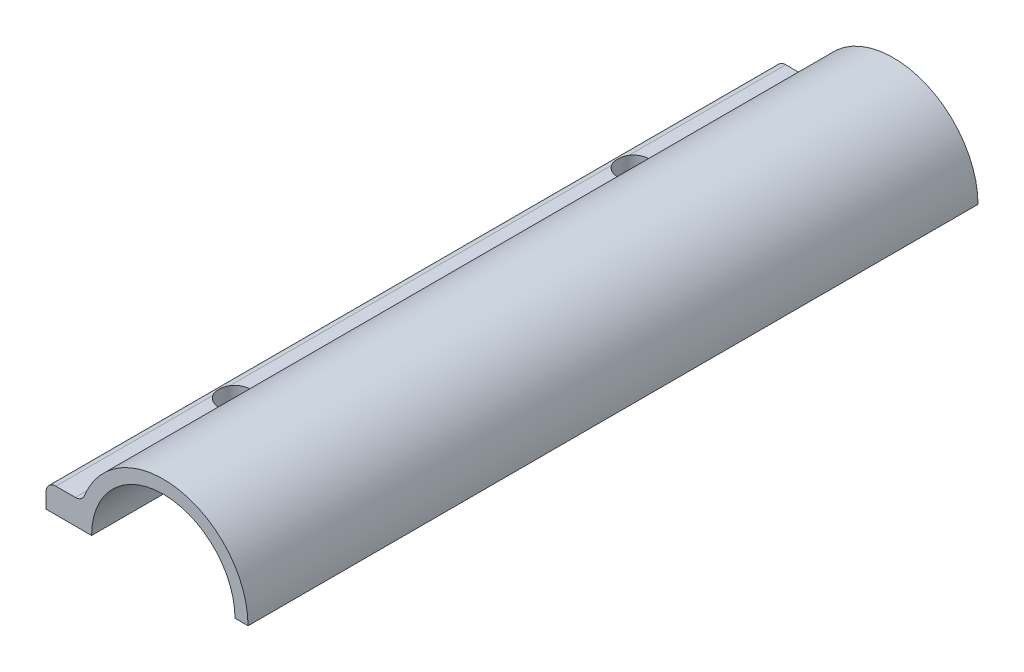
ISO-10303-21;
HEADER;
FILE_DESCRIPTION(('STEP AP214'),'2;1');
FILE_NAME('part.step','',(''),(''),'','','');
FILE_SCHEMA(('AUTOMOTIVE_DESIGN { 1 0 10303 214 1 1 1 1 }'));
ENDSEC;
DATA;
#1=APPLICATION_CONTEXT('core data for automotive mechanical design processes');
#2=APPLICATION_PROTOCOL_DEFINITION('international standard','automotive_design',2000,#1);
#3=PRODUCT_CONTEXT('',#1,'mechanical');
#4=PRODUCT('Part','Part','',(#3));
#5=PRODUCT_RELATED_PRODUCT_CATEGORY('part','',(#4));
#6=PRODUCT_DEFINITION_FORMATION('','',#4);
#7=PRODUCT_DEFINITION_CONTEXT('part definition',#1,'design');
#8=PRODUCT_DEFINITION('design','',#6,#7);
#9=PRODUCT_DEFINITION_SHAPE('','',#8);
#10=(LENGTH_UNIT() NAMED_UNIT(*) SI_UNIT(.MILLI.,.METRE.));
#11=(NAMED_UNIT(*) PLANE_ANGLE_UNIT() SI_UNIT($,.RADIAN.));
#12=(NAMED_UNIT(*) SI_UNIT($,.STERADIAN.) SOLID_ANGLE_UNIT());
#13=UNCERTAINTY_MEASURE_WITH_UNIT(LENGTH_MEASURE(1.E-05),#10,'distance_accuracy_value','');
#14=(GEOMETRIC_REPRESENTATION_CONTEXT(3) GLOBAL_UNCERTAINTY_ASSIGNED_CONTEXT((#13)) GLOBAL_UNIT_ASSIGNED_CONTEXT((#10,
#11,#12)) REPRESENTATION_CONTEXT('',''));
#15=CARTESIAN_POINT('',(0.,0.,0.));
#16=DIRECTION('',(0.,0.,1.));
#17=DIRECTION('',(1.,0.,0.));
#18=AXIS2_PLACEMENT_3D('',#15,#16,#17);
#19=CARTESIAN_POINT('',(0.,0.,112.));
#20=DIRECTION('',(0.,0.,-1.));
#21=DIRECTION('',(-1.,0.,0.));
#22=AXIS2_PLACEMENT_3D('',#19,#20,#21);
#23=CYLINDRICAL_SURFACE('',#22,13.);
#24=CARTESIAN_POINT('',(-12.4291552408038,3.81,90.0222217904894));
#25=CARTESIAN_POINT('',(-12.3982284512113,3.91089956997529,90.0034997624755));
#26=CARTESIAN_POINT('',(-12.3661317283124,4.01121346003548,89.9835119896116));
#27=CARTESIAN_POINT('',(-12.299698459949,4.21051513653637,89.9406959229196));
#28=CARTESIAN_POINT('',(-12.2653612921514,4.30950254523476,89.9178668382428));
#29=CARTESIAN_POINT('',(-12.1943879149924,4.50643013353187,89.8689474723593));
#30=CARTESIAN_POINT('',(-12.1577410883042,4.60436262254831,89.8428414860605));
#31=CARTESIAN_POINT('',(-12.0824621311183,4.79843206199417,89.7871145486518));
#32=CARTESIAN_POINT('',(-12.043830163876,4.89456915919058,89.757493886323));
#33=CARTESIAN_POINT('',(-11.9240165014657,5.18280671165133,89.6618464679093));
#34=CARTESIAN_POINT('',(-11.8399856356552,5.37177854272861,89.5897409416635));
#35=CARTESIAN_POINT('',(-11.6667676848822,5.73824166780659,89.4261202152413));
#36=CARTESIAN_POINT('',(-11.5775933137538,5.9157591504039,89.3346514978126));
#37=CARTESIAN_POINT('',(-11.4470320306952,6.16222418026182,89.185180750772));
#38=CARTESIAN_POINT('',(-11.406331782407,6.23719559977778,89.1364340131403));
#39=CARTESIAN_POINT('',(-11.325018786218,6.38364832318433,89.033881299472));
#40=CARTESIAN_POINT('',(-11.2844060422122,6.45512947466338,88.9800751028008));
#41=CARTESIAN_POINT('',(-11.1636693674584,6.66318470639524,88.8109028890037));
#42=CARTESIAN_POINT('',(-11.0843721375185,6.793883837498,88.6874802011722));
#43=CARTESIAN_POINT('',(-10.9322094611235,7.0361609608311,88.415322479502));
#44=CARTESIAN_POINT('',(-10.8594515943693,7.14744039808926,88.2662522474735));
#45=CARTESIAN_POINT('',(-10.7616271837335,7.29320616513867,88.0255113651239));
#46=CARTESIAN_POINT('',(-10.7309111968423,7.3382598995572,87.9424331652061));
#47=CARTESIAN_POINT('',(-10.6741768776466,7.42054101876091,87.7709933499878));
#48=CARTESIAN_POINT('',(-10.6481561632838,7.45777237366829,87.682634444216));
#49=CARTESIAN_POINT('',(-10.5928016906116,7.53629206843974,87.4663489675423));
#50=CARTESIAN_POINT('',(-10.5660440241288,7.57363153983909,87.3362768149118));
#51=CARTESIAN_POINT('',(-10.5254696126612,7.62992240292217,87.0703065664063));
#52=CARTESIAN_POINT('',(-10.511645313046,7.64888452940224,86.9344119201421));
#53=CARTESIAN_POINT('',(-10.49809661361,7.667470918999,86.6602727125025));
#54=CARTESIAN_POINT('',(-10.4984038478925,7.66705179626651,86.5220235715229));
#55=CARTESIAN_POINT('',(-10.5131735138527,7.64678563169003,86.2477395702959));
#56=CARTESIAN_POINT('',(-10.5276370864785,7.62693702390203,86.1117048894241));
#57=CARTESIAN_POINT('',(-10.5688319604157,7.56974013639379,85.849661617855));
#58=CARTESIAN_POINT('',(-10.5951898444094,7.53292385108843,85.7234758053285));
#59=CARTESIAN_POINT('',(-10.6580777023326,7.44367851990033,85.4794923167407));
#60=CARTESIAN_POINT('',(-10.6946116358128,7.39124339609859,85.3616979282733));
#61=CARTESIAN_POINT('',(-10.7902386445956,7.25122401845162,85.0952377253828));
#62=CARTESIAN_POINT('',(-10.8527086641131,7.15778847694174,84.9508593478511));
#63=CARTESIAN_POINT('',(-10.9865043468026,6.95067617977447,84.6821909749284));
#64=CARTESIAN_POINT('',(-11.0578425427065,6.83697067736841,84.557929993854));
#65=CARTESIAN_POINT('',(-11.1836872230932,6.62838935220942,84.3613492456227));
#66=CARTESIAN_POINT('',(-11.2372375662101,6.53730310446485,84.284286830222));
#67=CARTESIAN_POINT('',(-11.3450453294143,6.34836720055879,84.1394272515856));
#68=CARTESIAN_POINT('',(-11.399303071196,6.25051437354093,84.0716344770673));
#69=CARTESIAN_POINT('',(-11.5076139012565,6.04880085655439,83.9443189026743));
#70=CARTESIAN_POINT('',(-11.5616651225141,5.94491626716691,83.884832702958));
#71=CARTESIAN_POINT('',(-11.6684799317264,5.73242764160274,83.7736175224509));
#72=CARTESIAN_POINT('',(-11.7212431695686,5.62382234402179,83.7218906316381));
#73=CARTESIAN_POINT('',(-11.8357825055144,5.37923207682357,83.6151529066845));
#74=CARTESIAN_POINT('',(-11.8970983794893,5.24232315772381,83.5617700750548));
#75=CARTESIAN_POINT('',(-12.0159909452799,4.96376125179891,83.4638198498042));
#76=CARTESIAN_POINT('',(-12.0735658328977,4.8221060251179,83.4192566888349));
#77=CARTESIAN_POINT('',(-12.1835444287049,4.53698618439672,83.33830608825));
#78=CARTESIAN_POINT('',(-12.2360094291381,4.39357495958082,83.3018125715636));
#79=CARTESIAN_POINT('',(-12.3362064759213,4.10384849193917,83.2352505236596));
#80=CARTESIAN_POINT('',(-12.3839444612726,3.95753717759955,83.20517387399));
#81=CARTESIAN_POINT('',(-12.4291552408038,3.81,83.1777782095091));
#82=B_SPLINE_CURVE_WITH_KNOTS('',3,(#24,#25,#26,#27,#28,#29,#30,#31,#32,#33,#34,#35,#36,#37,#38,
#39,#40,#41,#42,#43,#44,#45,#46,#47,#48,#49,#50,#51,#52,#53,#54,#55,#56,#57,#58,#59,#60,#61,#62,
#63,#64,#65,#66,#67,#68,#69,#70,#71,#72,#73,#74,#75,#76,#77,#78,#79,#80,#81),.UNSPECIFIED.,.F.,
.F.,(4,2,2,2,2,2,2,2,2,2,2,2,2,2,2,2,2,2,2,2,2,2,2,2,2,2,2,2,4),(0.,0.321536985146419,
0.643163667681298,0.966395285175215,1.28960036292443,1.94564028305376,2.60012283734822,
2.89471131172264,3.18931263857775,3.77656154281625,4.37216688377753,4.66980925165467,
4.96730018908383,5.37923068866681,5.7909204211509,6.20353178522107,6.61617640696612,
7.01668159039797,7.41734283058582,7.96323943471932,8.50991647637114,8.90174214500386,
9.29375268611981,9.68743938509992,10.0812319343301,10.5584955183937,11.0359875937615,
11.5067705561359,11.9769543170507),.UNSPECIFIED.);
#83=CARTESIAN_POINT('',(-12.0969349013349,4.76068965517241,89.7976988806903));
#84=VERTEX_POINT('',#83);
#85=CARTESIAN_POINT('',(-12.0969349013349,4.76068965517241,83.4023011193082));
#86=VERTEX_POINT('',#85);
#87=EDGE_CURVE('E279',#84,#86,#82,.T.);
#88=ORIENTED_EDGE('',*,*,#87,.F.);
#89=DIRECTION('',(0.,0.,-1.));
#90=VECTOR('',#89,1.);
#91=CARTESIAN_POINT('',(-12.0969349013349,4.76068965517241,112.));
#92=LINE('',#91,#90);
#93=CARTESIAN_POINT('',(-12.0969349013349,4.76068965517241,112.));
#94=VERTEX_POINT('',#93);
#95=EDGE_CURVE('E224',#84,#94,#92,.F.);
#96=ORIENTED_EDGE('',*,*,#95,.T.);
#97=CARTESIAN_POINT('',(0.,0.,112.));
#98=DIRECTION('',(0.,0.,1.));
#99=DIRECTION('',(1.,0.,0.));
#100=AXIS2_PLACEMENT_3D('',#97,#98,#99);
#101=CIRCLE('',#100,13.);
#102=CARTESIAN_POINT('',(13.,0.,112.));
#103=VERTEX_POINT('',#102);
#104=EDGE_CURVE('E170',#103,#94,#101,.T.);
#105=ORIENTED_EDGE('',*,*,#104,.F.);
#106=DIRECTION('',(0.,0.,-1.));
#107=VECTOR('',#106,1.);
#108=CARTESIAN_POINT('',(13.,0.,112.));
#109=LINE('',#108,#107);
#110=CARTESIAN_POINT('',(13.,0.,0.));
#111=VERTEX_POINT('',#110);
#112=EDGE_CURVE('E162',#103,#111,#109,.T.);
#113=ORIENTED_EDGE('',*,*,#112,.T.);
#114=CARTESIAN_POINT('',(0.,0.,0.));
#115=DIRECTION('',(0.,0.,1.));
#116=DIRECTION('',(1.,0.,0.));
#117=AXIS2_PLACEMENT_3D('',#114,#115,#116);
#118=CIRCLE('',#117,13.);
#119=CARTESIAN_POINT('',(-12.0969349013349,4.76068965517241,0.));
#120=VERTEX_POINT('',#119);
#121=EDGE_CURVE('E193',#111,#120,#118,.T.);
#122=ORIENTED_EDGE('',*,*,#121,.T.);
#123=DIRECTION('',(0.,0.,-1.));
#124=VECTOR('',#123,1.);
#125=CARTESIAN_POINT('',(-12.0969349013349,4.76068965517241,112.));
#126=LINE('',#125,#124);
#127=CARTESIAN_POINT('',(-12.0969349013349,4.76068965517241,22.2023011193077));
#128=VERTEX_POINT('',#127);
#129=EDGE_CURVE('E220',#120,#128,#126,.F.);
#130=ORIENTED_EDGE('',*,*,#129,.T.);
#131=CARTESIAN_POINT('',(-12.4291552408038,3.81,28.8222217904898));
#132=CARTESIAN_POINT('',(-12.3982284512113,3.91089956997532,28.803499762476));
#133=CARTESIAN_POINT('',(-12.3661317283124,4.01121346003553,28.783511989612));
#134=CARTESIAN_POINT('',(-12.299698459949,4.21051513653647,28.7406959229201));
#135=CARTESIAN_POINT('',(-12.2653612921513,4.30950254523489,28.7178668382433));
#136=CARTESIAN_POINT('',(-12.1943879149923,4.50643013353205,28.6689474723598));
#137=CARTESIAN_POINT('',(-12.1577410883041,4.60436262254851,28.642841486061));
#138=CARTESIAN_POINT('',(-12.0824621311182,4.79843206199442,28.5871145486523));
#139=CARTESIAN_POINT('',(-12.0438301638759,4.89456915919086,28.5574938863235));
#140=CARTESIAN_POINT('',(-11.9240165014655,5.18280671165168,28.4618464679098));
#141=CARTESIAN_POINT('',(-11.839985635655,5.37177854272901,28.389740941664));
#142=CARTESIAN_POINT('',(-11.6667676848819,5.73824166780708,28.2261202152418));
#143=CARTESIAN_POINT('',(-11.5775933137536,5.91575915040444,28.1346514978131));
#144=CARTESIAN_POINT('',(-11.4470320306949,6.16222418026241,27.9851807507725));
#145=CARTESIAN_POINT('',(-11.4063317824067,6.23719559977839,27.9364340131408));
#146=CARTESIAN_POINT('',(-11.3250187862177,6.38364832318496,27.8338812994725));
#147=CARTESIAN_POINT('',(-11.2844060422119,6.45512947466402,27.7800751028013));
#148=CARTESIAN_POINT('',(-11.163669367458,6.66318470639592,27.6109028890042));
#149=CARTESIAN_POINT('',(-11.084372137518,6.7938838374987,27.4874802011726));
#150=CARTESIAN_POINT('',(-10.932209461123,7.03616096083185,27.2153224795024));
#151=CARTESIAN_POINT('',(-10.8594515943688,7.14744039809004,27.066252247474));
#152=CARTESIAN_POINT('',(-10.7616271837329,7.29320616513948,26.8255113651244));
#153=CARTESIAN_POINT('',(-10.7309111968417,7.33825989955801,26.7424331652065));
#154=CARTESIAN_POINT('',(-10.6741768776461,7.42054101876175,26.5709933499882));
#155=CARTESIAN_POINT('',(-10.6481561632832,7.45777237366914,26.4826344442164));
#156=CARTESIAN_POINT('',(-10.592801690611,7.53629206844061,26.2663489675427));
#157=CARTESIAN_POINT('',(-10.5660440241282,7.57363153983998,26.1362768149121));
#158=CARTESIAN_POINT('',(-10.5254696126605,7.62992240292308,25.8703065664066));
#159=CARTESIAN_POINT('',(-10.5116453130453,7.64888452940316,25.7344119201424));
#160=CARTESIAN_POINT('',(-10.4980966136093,7.66747091899994,25.4602727125027));
#161=CARTESIAN_POINT('',(-10.4984038478918,7.66705179626746,25.3220235715231));
#162=CARTESIAN_POINT('',(-10.513173513852,7.64678563169099,25.047739570296));
#163=CARTESIAN_POINT('',(-10.5276370864778,7.62693702390299,24.9117048894242));
#164=CARTESIAN_POINT('',(-10.568831960415,7.56974013639476,24.6496616178551));
#165=CARTESIAN_POINT('',(-10.5951898444087,7.53292385108941,24.5234758053286));
#166=CARTESIAN_POINT('',(-10.6580777023319,7.44367851990132,24.2794923167408));
#167=CARTESIAN_POINT('',(-10.6946116358121,7.39124339609958,24.1616979282733));
#168=CARTESIAN_POINT('',(-10.7902386445949,7.25122401845262,23.8952377253828));
#169=CARTESIAN_POINT('',(-10.8527086641124,7.15778847694276,23.7508593478511));
#170=CARTESIAN_POINT('',(-10.986504346802,6.9506761797755,23.4821909749284));
#171=CARTESIAN_POINT('',(-11.0578425427059,6.83697067736944,23.357929993854));
#172=CARTESIAN_POINT('',(-11.1836872230926,6.62838935221047,23.1613492456226));
#173=CARTESIAN_POINT('',(-11.2372375662094,6.53730310446591,23.0842868302219));
#174=CARTESIAN_POINT('',(-11.3450453294137,6.34836720055987,22.9394272515855));
#175=CARTESIAN_POINT('',(-11.3993030711954,6.25051437354202,22.8716344770672));
#176=CARTESIAN_POINT('',(-11.507613901256,6.04880085655551,22.7443189026742));
#177=CARTESIAN_POINT('',(-11.5616651225135,5.94491626716804,22.6848327029579));
#178=CARTESIAN_POINT('',(-11.6684799317258,5.73242764160388,22.5736175224509));
#179=CARTESIAN_POINT('',(-11.7212431695681,5.62382234402294,22.5218906316381));
#180=CARTESIAN_POINT('',(-11.835782505514,5.37923207682464,22.4151529066844));
#181=CARTESIAN_POINT('',(-11.8970983794888,5.2423231577248,22.3617700750547));
#182=CARTESIAN_POINT('',(-12.0159909452796,4.96376125179971,22.2638198498039));
#183=CARTESIAN_POINT('',(-12.0735658328974,4.8221060251186,22.2192566888346));
#184=CARTESIAN_POINT('',(-12.1835444287047,4.53698618439723,22.1383060882497));
#185=CARTESIAN_POINT('',(-12.2360094291379,4.39357495958123,22.1018125715632));
#186=CARTESIAN_POINT('',(-12.3362064759213,4.10384849193938,22.0352505236593));
#187=CARTESIAN_POINT('',(-12.3839444612726,3.95753717759965,22.0051738739897));
#188=CARTESIAN_POINT('',(-12.4291552408038,3.81,21.9777782095088));
#189=B_SPLINE_CURVE_WITH_KNOTS('',3,(#131,#132,#133,#134,#135,#136,#137,#138,#139,#140,#141,
#142,#143,#144,#145,#146,#147,#148,#149,#150,#151,#152,#153,#154,#155,#156,#157,#158,#159,#160,
#161,#162,#163,#164,#165,#166,#167,#168,#169,#170,#171,#172,#173,#174,#175,#176,#177,#178,#179,
#180,#181,#182,#183,#184,#185,#186,#187,#188),.UNSPECIFIED.,.F.,.F.,(4,2,2,2,2,2,2,2,2,2,2,2,2,
2,2,2,2,2,2,2,2,2,2,2,2,2,2,2,4),(0.,0.321536985146496,0.643163667681457,0.966395285175453,
1.28960036292475,1.94564028305424,2.60012283734884,2.89471131172329,3.18931263857845,
3.77656154281706,4.37216688377843,4.66980925165561,4.96730018908481,5.37923068866785,
5.79092042115201,6.20353178522226,6.61617640696737,7.01668159039927,7.41734283058716,
7.96323943472066,8.50991647637253,8.90174214500523,9.29375268612117,9.68743938510127,
10.0812319343314,10.5584955183954,11.0359875937635,11.5067705561382,11.9769543170534),.UNSPECIFIED.);
#190=CARTESIAN_POINT('',(-12.0969349013349,4.76068965517241,28.5976988806909));
#191=VERTEX_POINT('',#190);
#192=EDGE_CURVE('E286',#191,#128,#189,.T.);
#193=ORIENTED_EDGE('',*,*,#192,.F.);
#194=DIRECTION('',(0.,0.,-1.));
#195=VECTOR('',#194,1.);
#196=CARTESIAN_POINT('',(-12.0969349013349,4.76068965517241,112.));
#197=LINE('',#196,#195);
#198=EDGE_CURVE('E222',#191,#86,#197,.F.);
#199=ORIENTED_EDGE('',*,*,#198,.T.);
#200=EDGE_LOOP('',(#88,#96,#105,#113,#122,#130,#193,#199));
#201=FACE_BOUND('',#200,.T.);
#202=ADVANCED_FACE('F43',(#201),#23,.T.);
#203=CARTESIAN_POINT('',(0.,0.,112.));
#204=DIRECTION('',(0.,0.,-1.));
#205=DIRECTION('',(-1.,0.,0.));
#206=AXIS2_PLACEMENT_3D('',#203,#204,#205);
#207=CYLINDRICAL_SURFACE('',#206,11.);
#208=CARTESIAN_POINT('',(0.,0.,0.));
#209=DIRECTION('',(0.,0.,1.));
#210=DIRECTION('',(1.,0.,0.));
#211=AXIS2_PLACEMENT_3D('',#208,#209,#210);
#212=CIRCLE('',#211,11.);
#213=CARTESIAN_POINT('',(11.,0.,0.));
#214=VERTEX_POINT('',#213);
#215=CARTESIAN_POINT('',(-11.,0.,0.));
#216=VERTEX_POINT('',#215);
#217=EDGE_CURVE('E158',#214,#216,#212,.T.);
#218=ORIENTED_EDGE('',*,*,#217,.F.);
#219=DIRECTION('',(0.,0.,-1.));
#220=VECTOR('',#219,1.);
#221=CARTESIAN_POINT('',(11.,0.,112.));
#222=LINE('',#221,#220);
#223=CARTESIAN_POINT('',(11.,0.,112.));
#224=VERTEX_POINT('',#223);
#225=EDGE_CURVE('E152',#224,#214,#222,.T.);
#226=ORIENTED_EDGE('',*,*,#225,.F.);
#227=CARTESIAN_POINT('',(0.,0.,112.));
#228=DIRECTION('',(0.,0.,1.));
#229=DIRECTION('',(1.,0.,0.));
#230=AXIS2_PLACEMENT_3D('',#227,#228,#229);
#231=CIRCLE('',#230,11.);
#232=CARTESIAN_POINT('',(-11.,0.,112.));
#233=VERTEX_POINT('',#232);
#234=EDGE_CURVE('E156',#224,#233,#231,.T.);
#235=ORIENTED_EDGE('',*,*,#234,.T.);
#236=DIRECTION('',(0.,0.,-1.));
#237=VECTOR('',#236,1.);
#238=CARTESIAN_POINT('',(-11.,0.,112.));
#239=LINE('',#238,#237);
#240=EDGE_CURVE('E200',#233,#216,#239,.T.);
#241=ORIENTED_EDGE('',*,*,#240,.T.);
#242=EDGE_LOOP('',(#218,#226,#235,#241));
#243=FACE_BOUND('',#242,.T.);
#244=ADVANCED_FACE('F154',(#243),#207,.F.);
#245=CARTESIAN_POINT('',(0.,0.,112.));
#246=DIRECTION('',(0.,1.,0.));
#247=DIRECTION('',(0.,0.,1.));
#248=AXIS2_PLACEMENT_3D('',#245,#246,#247);
#249=PLANE('',#248);
#250=DIRECTION('',(1.,0.,0.));
#251=VECTOR('',#250,1.);
#252=CARTESIAN_POINT('',(0.,0.,0.));
#253=LINE('',#252,#251);
#254=EDGE_CURVE('E181',#214,#111,#253,.T.);
#255=ORIENTED_EDGE('',*,*,#254,.T.);
#256=ORIENTED_EDGE('',*,*,#112,.F.);
#257=DIRECTION('',(1.,0.,0.));
#258=VECTOR('',#257,1.);
#259=CARTESIAN_POINT('',(0.,0.,112.));
#260=LINE('',#259,#258);
#261=EDGE_CURVE('E165',#224,#103,#260,.T.);
#262=ORIENTED_EDGE('',*,*,#261,.F.);
#263=ORIENTED_EDGE('',*,*,#225,.T.);
#264=EDGE_LOOP('',(#255,#256,#262,#263));
#265=FACE_BOUND('',#264,.T.);
#266=ADVANCED_FACE('F166',(#265),#249,.F.);
#267=CARTESIAN_POINT('',(0.,3.81,112.));
#268=DIRECTION('',(0.,1.,0.));
#269=DIRECTION('',(-1.,0.,0.));
#270=AXIS2_PLACEMENT_3D('',#267,#268,#269);
#271=PLANE('',#270);
#272=DIRECTION('',(1.,0.,0.));
#273=VECTOR('',#272,1.);
#274=CARTESIAN_POINT('',(0.,3.81,112.));
#275=LINE('',#274,#273);
#276=CARTESIAN_POINT('',(-16.4999999999998,3.81,112.));
#277=VERTEX_POINT('',#276);
#278=CARTESIAN_POINT('',(-13.4927350822582,3.81,112.));
#279=VERTEX_POINT('',#278);
#280=EDGE_CURVE('E187',#277,#279,#275,.T.);
#281=ORIENTED_EDGE('',*,*,#280,.T.);
#282=DIRECTION('',(0.,0.,-1.));
#283=VECTOR('',#282,1.);
#284=CARTESIAN_POINT('',(-13.4927350822582,3.81,112.));
#285=LINE('',#284,#283);
#286=CARTESIAN_POINT('',(-13.4927350822582,3.81,90.4711002809897));
#287=VERTEX_POINT('',#286);
#288=EDGE_CURVE('E217',#279,#287,#285,.T.);
#289=ORIENTED_EDGE('',*,*,#288,.T.);
#290=CARTESIAN_POINT('',(-14.500000000001,3.81,86.5999999999993));
#291=DIRECTION('',(0.,1.,0.));
#292=DIRECTION('',(-1.,0.,0.));
#293=AXIS2_PLACEMENT_3D('',#290,#291,#292);
#294=CIRCLE('',#293,4.);
#295=CARTESIAN_POINT('',(-13.4927350822582,3.81,82.7288997190088));
#296=VERTEX_POINT('',#295);
#297=EDGE_CURVE('E353',#287,#296,#294,.T.);
#298=ORIENTED_EDGE('',*,*,#297,.T.);
#299=DIRECTION('',(0.,0.,-1.));
#300=VECTOR('',#299,1.);
#301=CARTESIAN_POINT('',(-13.4927350822582,3.81,112.));
#302=LINE('',#301,#300);
#303=CARTESIAN_POINT('',(-13.4927350822582,3.81,29.27110028099));
#304=VERTEX_POINT('',#303);
#305=EDGE_CURVE('E214',#296,#304,#302,.T.);
#306=ORIENTED_EDGE('',*,*,#305,.T.);
#307=CARTESIAN_POINT('',(-14.5000000000003,3.81,25.3999999999993));
#308=DIRECTION('',(0.,1.,0.));
#309=DIRECTION('',(-1.,0.,0.));
#310=AXIS2_PLACEMENT_3D('',#307,#308,#309);
#311=CIRCLE('',#310,4.);
#312=CARTESIAN_POINT('',(-13.4927350822582,3.81,21.5288997190087));
#313=VERTEX_POINT('',#312);
#314=EDGE_CURVE('E357',#304,#313,#311,.T.);
#315=ORIENTED_EDGE('',*,*,#314,.T.);
#316=DIRECTION('',(0.,0.,-1.));
#317=VECTOR('',#316,1.);
#318=CARTESIAN_POINT('',(-13.4927350822582,3.81,112.));
#319=LINE('',#318,#317);
#320=CARTESIAN_POINT('',(-13.4927350822582,3.81,0.));
#321=VERTEX_POINT('',#320);
#322=EDGE_CURVE('E161',#313,#321,#319,.T.);
#323=ORIENTED_EDGE('',*,*,#322,.T.);
#324=DIRECTION('',(1.,0.,0.));
#325=VECTOR('',#324,1.);
#326=CARTESIAN_POINT('',(0.,3.81,0.));
#327=LINE('',#326,#325);
#328=CARTESIAN_POINT('',(-16.4999999999998,3.81,0.));
#329=VERTEX_POINT('',#328);
#330=EDGE_CURVE('E196',#329,#321,#327,.T.);
#331=ORIENTED_EDGE('',*,*,#330,.F.);
#332=DIRECTION('',(0.,0.,-1.));
#333=VECTOR('',#332,1.);
#334=CARTESIAN_POINT('',(-16.4999999999998,3.81,112.));
#335=LINE('',#334,#333);
#336=CARTESIAN_POINT('',(-16.4999999999998,3.81,24.0733500838562));
#337=VERTEX_POINT('',#336);
#338=EDGE_CURVE('E212',#329,#337,#335,.F.);
#339=ORIENTED_EDGE('',*,*,#338,.T.);
#340=CARTESIAN_POINT('',(-14.5000000000004,3.81,25.3999999999993));
#341=DIRECTION('',(0.,1.,0.));
#342=DIRECTION('',(0.,0.,1.));
#343=AXIS2_PLACEMENT_3D('',#340,#341,#342);
#344=CIRCLE('',#343,2.4);
#345=CARTESIAN_POINT('',(-16.4999999999998,3.81,26.7266499161423));
#346=VERTEX_POINT('',#345);
#347=EDGE_CURVE('E369',#346,#337,#344,.T.);
#348=ORIENTED_EDGE('',*,*,#347,.F.);
#349=DIRECTION('',(0.,0.,-1.));
#350=VECTOR('',#349,1.);
#351=CARTESIAN_POINT('',(-16.4999999999998,3.81,112.));
#352=LINE('',#351,#350);
#353=CARTESIAN_POINT('',(-16.4999999999998,3.81,85.2733500838553));
#354=VERTEX_POINT('',#353);
#355=EDGE_CURVE('E210',#346,#354,#352,.F.);
#356=ORIENTED_EDGE('',*,*,#355,.T.);
#357=CARTESIAN_POINT('',(-14.500000000001,3.81,86.5999999999993));
#358=DIRECTION('',(0.,1.,0.));
#359=DIRECTION('',(0.,0.,1.));
#360=AXIS2_PLACEMENT_3D('',#357,#358,#359);
#361=CIRCLE('',#360,2.4);
#362=CARTESIAN_POINT('',(-16.4999999999998,3.81,87.9266499161432));
#363=VERTEX_POINT('',#362);
#364=EDGE_CURVE('E293',#363,#354,#361,.T.);
#365=ORIENTED_EDGE('',*,*,#364,.F.);
#366=DIRECTION('',(0.,0.,-1.));
#367=VECTOR('',#366,1.);
#368=CARTESIAN_POINT('',(-16.4999999999998,3.81,112.));
#369=LINE('',#368,#367);
#370=EDGE_CURVE('E208',#363,#277,#369,.F.);
#371=ORIENTED_EDGE('',*,*,#370,.T.);
#372=EDGE_LOOP('',(#281,#289,#298,#306,#315,#323,#331,#339,#348,#356,#365,#371));
#373=FACE_BOUND('',#372,.T.);
#374=ADVANCED_FACE('F267',(#373),#271,.T.);
#375=CARTESIAN_POINT('',(-17.9999999999998,0.,112.));
#376=DIRECTION('',(1.,0.,0.));
#377=DIRECTION('',(0.,0.,-1.));
#378=AXIS2_PLACEMENT_3D('',#375,#376,#377);
#379=PLANE('',#378);
#380=DIRECTION('',(0.,-1.,0.));
#381=VECTOR('',#380,1.);
#382=CARTESIAN_POINT('',(-17.9999999999998,0.,112.));
#383=LINE('',#382,#381);
#384=CARTESIAN_POINT('',(-17.9999999999998,2.31,112.));
#385=VERTEX_POINT('',#384);
#386=CARTESIAN_POINT('',(-17.9999999999998,0.,112.));
#387=VERTEX_POINT('',#386);
#388=EDGE_CURVE('E190',#385,#387,#383,.T.);
#389=ORIENTED_EDGE('',*,*,#388,.F.);
#390=DIRECTION('',(0.,0.,-1.));
#391=VECTOR('',#390,1.);
#392=CARTESIAN_POINT('',(-17.9999999999998,2.31,0.));
#393=LINE('',#392,#391);
#394=CARTESIAN_POINT('',(-17.9999999999998,2.31,0.));
#395=VERTEX_POINT('',#394);
#396=EDGE_CURVE('E226',#385,#395,#393,.T.);
#397=ORIENTED_EDGE('',*,*,#396,.T.);
#398=DIRECTION('',(0.,-1.,0.));
#399=VECTOR('',#398,1.);
#400=CARTESIAN_POINT('',(-17.9999999999998,0.,0.));
#401=LINE('',#400,#399);
#402=CARTESIAN_POINT('',(-17.9999999999998,0.,0.));
#403=VERTEX_POINT('',#402);
#404=EDGE_CURVE('E179',#395,#403,#401,.T.);
#405=ORIENTED_EDGE('',*,*,#404,.T.);
#406=DIRECTION('',(0.,0.,-1.));
#407=VECTOR('',#406,1.);
#408=CARTESIAN_POINT('',(-17.9999999999998,0.,112.));
#409=LINE('',#408,#407);
#410=EDGE_CURVE('E202',#387,#403,#409,.T.);
#411=ORIENTED_EDGE('',*,*,#410,.F.);
#412=EDGE_LOOP('',(#389,#397,#405,#411));
#413=FACE_BOUND('',#412,.T.);
#414=ADVANCED_FACE('F263',(#413),#379,.F.);
#415=CARTESIAN_POINT('',(-14.500000000001,0.,86.5999999999993));
#416=DIRECTION('',(0.,1.,0.));
#417=DIRECTION('',(0.,0.,1.));
#418=AXIS2_PLACEMENT_3D('',#415,#416,#417);
#419=CIRCLE('',#418,2.4);
#420=CARTESIAN_POINT('',(-14.500000000001,0.,88.9999999999993));
#421=VERTEX_POINT('',#420);
#422=EDGE_CURVE('E339',#421,#421,#419,.T.);
#423=ORIENTED_EDGE('',*,*,#422,.T.);
#424=EDGE_LOOP('',(#423));
#425=FACE_BOUND('',#424,.T.);
#426=CARTESIAN_POINT('',(-14.5000000000004,0.,25.3999999999993));
#427=DIRECTION('',(0.,1.,0.));
#428=DIRECTION('',(0.,0.,1.));
#429=AXIS2_PLACEMENT_3D('',#426,#427,#428);
#430=CIRCLE('',#429,2.4);
#431=CARTESIAN_POINT('',(-14.5000000000004,0.,27.7999999999993));
#432=VERTEX_POINT('',#431);
#433=EDGE_CURVE('E183',#432,#432,#430,.T.);
#434=ORIENTED_EDGE('',*,*,#433,.T.);
#435=EDGE_LOOP('',(#434));
#436=FACE_BOUND('',#435,.T.);
#437=EDGE_CURVE('E176',#403,#216,#253,.T.);
#438=ORIENTED_EDGE('',*,*,#437,.T.);
#439=ORIENTED_EDGE('',*,*,#240,.F.);
#440=EDGE_CURVE('E172',#387,#233,#260,.T.);
#441=ORIENTED_EDGE('',*,*,#440,.F.);
#442=ORIENTED_EDGE('',*,*,#410,.T.);
#443=EDGE_LOOP('',(#438,#439,#441,#442));
#444=FACE_BOUND('',#443,.T.);
#445=ADVANCED_FACE('F257',(#425,#436,#444),#249,.F.);
#446=CARTESIAN_POINT('',(0.,0.,112.));
#447=DIRECTION('',(0.,0.,1.));
#448=DIRECTION('',(1.,0.,0.));
#449=AXIS2_PLACEMENT_3D('',#446,#447,#448);
#450=PLANE('',#449);
#451=ORIENTED_EDGE('',*,*,#280,.F.);
#452=CARTESIAN_POINT('',(-16.4999999999998,2.31,112.));
#453=DIRECTION('',(0.,0.,1.));
#454=DIRECTION('',(1.,0.,0.));
#455=AXIS2_PLACEMENT_3D('',#452,#453,#454);
#456=CIRCLE('',#455,1.5);
#457=EDGE_CURVE('E64',#277,#385,#456,.T.);
#458=ORIENTED_EDGE('',*,*,#457,.T.);
#459=ORIENTED_EDGE('',*,*,#388,.T.);
#460=ORIENTED_EDGE('',*,*,#440,.T.);
#461=ORIENTED_EDGE('',*,*,#234,.F.);
#462=ORIENTED_EDGE('',*,*,#261,.T.);
#463=ORIENTED_EDGE('',*,*,#104,.T.);
#464=CARTESIAN_POINT('',(-13.4927350822582,5.31,112.));
#465=DIRECTION('',(0.,0.,1.));
#466=DIRECTION('',(1.,0.,0.));
#467=AXIS2_PLACEMENT_3D('',#464,#465,#466);
#468=CIRCLE('',#467,1.5);
#469=EDGE_CURVE('E313',#94,#279,#468,.F.);
#470=ORIENTED_EDGE('',*,*,#469,.T.);
#471=EDGE_LOOP('',(#451,#458,#459,#460,#461,#462,#463,#470));
#472=FACE_BOUND('',#471,.T.);
#473=ADVANCED_FACE('F173',(#472),#450,.T.);
#474=CARTESIAN_POINT('',(0.,0.,0.));
#475=DIRECTION('',(0.,0.,1.));
#476=DIRECTION('',(1.,0.,0.));
#477=AXIS2_PLACEMENT_3D('',#474,#475,#476);
#478=PLANE('',#477);
#479=ORIENTED_EDGE('',*,*,#404,.F.);
#480=CARTESIAN_POINT('',(-16.4999999999998,2.31,0.));
#481=DIRECTION('',(0.,0.,1.));
#482=DIRECTION('',(1.,0.,0.));
#483=AXIS2_PLACEMENT_3D('',#480,#481,#482);
#484=CIRCLE('',#483,1.5);
#485=EDGE_CURVE('E72',#395,#329,#484,.F.);
#486=ORIENTED_EDGE('',*,*,#485,.T.);
#487=ORIENTED_EDGE('',*,*,#330,.T.);
#488=CARTESIAN_POINT('',(-13.4927350822582,5.31,0.));
#489=DIRECTION('',(0.,0.,1.));
#490=DIRECTION('',(1.,0.,0.));
#491=AXIS2_PLACEMENT_3D('',#488,#489,#490);
#492=CIRCLE('',#491,1.5);
#493=EDGE_CURVE('E57',#321,#120,#492,.T.);
#494=ORIENTED_EDGE('',*,*,#493,.T.);
#495=ORIENTED_EDGE('',*,*,#121,.F.);
#496=ORIENTED_EDGE('',*,*,#254,.F.);
#497=ORIENTED_EDGE('',*,*,#217,.T.);
#498=ORIENTED_EDGE('',*,*,#437,.F.);
#499=EDGE_LOOP('',(#479,#486,#487,#494,#495,#496,#497,#498));
#500=FACE_BOUND('',#499,.T.);
#501=ADVANCED_FACE('F251',(#500),#478,.F.);
#502=CARTESIAN_POINT('',(-14.5000000000004,3.81,25.3999999999993));
#503=DIRECTION('',(0.,1.,0.));
#504=DIRECTION('',(0.,0.,1.));
#505=AXIS2_PLACEMENT_3D('',#502,#503,#504);
#506=CYLINDRICAL_SURFACE('',#505,2.4);
#507=ORIENTED_EDGE('',*,*,#433,.F.);
#508=EDGE_LOOP('',(#507));
#509=FACE_BOUND('',#508,.T.);
#510=ORIENTED_EDGE('',*,*,#347,.T.);
#511=CARTESIAN_POINT('',(-16.4999999999998,3.81,24.0733500838562));
#512=CARTESIAN_POINT('',(-16.5351818402749,3.80998603595226,24.1263781533728));
#513=CARTESIAN_POINT('',(-16.5682306661831,3.80876223990136,24.1807899921825));
#514=CARTESIAN_POINT('',(-16.6298720404266,3.80468983261639,24.2919941448196));
#515=CARTESIAN_POINT('',(-16.6584666808507,3.8018419871305,24.3487853250903));
#516=CARTESIAN_POINT('',(-16.711069938711,3.79531146582251,24.4644711735511));
#517=CARTESIAN_POINT('',(-16.7350738115443,3.79162793481279,24.5233679440906));
#518=CARTESIAN_POINT('',(-16.7783342170615,3.78411430653365,24.6428793306619));
#519=CARTESIAN_POINT('',(-16.7975901128849,3.78028418968172,24.7034941759298));
#520=CARTESIAN_POINT('',(-16.8319223867992,3.77292472713277,24.8285859936061));
#521=CARTESIAN_POINT('',(-16.8467965744276,3.76941398729391,24.8931197117847));
#522=CARTESIAN_POINT('',(-16.8711671435747,3.7634073429525,25.0232410203815));
#523=CARTESIAN_POINT('',(-16.8806636982662,3.76091140577157,25.0888285767937));
#524=CARTESIAN_POINT('',(-16.894195544409,3.75729375491488,25.2205399756348));
#525=CARTESIAN_POINT('',(-16.8982361248185,3.75617071047295,25.2866632360978));
#526=CARTESIAN_POINT('',(-16.9008372403519,3.75545197555069,25.419024327149));
#527=CARTESIAN_POINT('',(-16.8993979324698,3.75585624131422,25.4852621544005));
#528=CARTESIAN_POINT('',(-16.8910731963632,3.75812983287326,25.6170397952146));
#529=CARTESIAN_POINT('',(-16.88421465688,3.7599919249172,25.682581440117));
#530=CARTESIAN_POINT('',(-16.8651421567146,3.76491157883285,25.8128391932443));
#531=CARTESIAN_POINT('',(-16.8529276844704,3.76796925489552,25.8775552220043));
#532=CARTESIAN_POINT('',(-16.823234748459,3.77483836181256,26.0057290900972));
#533=CARTESIAN_POINT('',(-16.8057560602409,3.77864982480384,26.0691868756592));
#534=CARTESIAN_POINT('',(-16.7656521873973,3.78642956547451,26.1944478581327));
#535=CARTESIAN_POINT('',(-16.7430264232595,3.79039786077014,26.2562508678555));
#536=CARTESIAN_POINT('',(-16.6882929828185,3.79843793058148,26.3886183750218));
#537=CARTESIAN_POINT('',(-16.6552152434303,3.80240315742851,26.4587919747343));
#538=CARTESIAN_POINT('',(-16.5824720083196,3.80816616596582,26.5955386825897));
#539=CARTESIAN_POINT('',(-16.5428200842858,3.80996835114557,26.6621188412406));
#540=CARTESIAN_POINT('',(-16.4999999999998,3.81,26.7266499161423));
#541=B_SPLINE_CURVE_WITH_KNOTS('',3,(#511,#512,#513,#514,#515,#516,#517,#518,#519,#520,#521,
#522,#523,#524,#525,#526,#527,#528,#529,#530,#531,#532,#533,#534,#535,#536,#537,#538,#539,#540),
.UNSPECIFIED.,.F.,.F.,(4,2,2,2,2,2,2,2,2,2,2,2,2,2,4),(0.,0.190814810813786,0.381539725702338,
0.572460703869177,0.763407276935087,0.962131584472826,1.16084949224273,1.35937462654854,
1.55789407332065,1.75543465976324,1.95299411803842,2.15056200087188,2.34815213900554,
2.58079773838545,2.81296891344386),.UNSPECIFIED.);
#542=EDGE_CURVE('E229',#337,#346,#541,.T.);
#543=ORIENTED_EDGE('',*,*,#542,.T.);
#544=EDGE_LOOP('',(#510,#543));
#545=FACE_BOUND('',#544,.T.);
#546=ADVANCED_FACE('F246',(#509,#545),#506,.F.);
#547=CARTESIAN_POINT('',(-14.500000000001,3.81,86.5999999999993));
#548=DIRECTION('',(0.,1.,0.));
#549=DIRECTION('',(0.,0.,1.));
#550=AXIS2_PLACEMENT_3D('',#547,#548,#549);
#551=CYLINDRICAL_SURFACE('',#550,2.4);
#552=ORIENTED_EDGE('',*,*,#422,.F.);
#553=EDGE_LOOP('',(#552));
#554=FACE_BOUND('',#553,.T.);
#555=ORIENTED_EDGE('',*,*,#364,.T.);
#556=CARTESIAN_POINT('',(-16.4999999999998,3.81,85.2733500838553));
#557=CARTESIAN_POINT('',(-16.5351818402749,3.80998603595226,85.3263781533718));
#558=CARTESIAN_POINT('',(-16.5682306661832,3.80876223990136,85.3807899921815));
#559=CARTESIAN_POINT('',(-16.6298720404267,3.80468983261638,85.4919941448186));
#560=CARTESIAN_POINT('',(-16.6584666808508,3.80184198713049,85.5487853250892));
#561=CARTESIAN_POINT('',(-16.7110699387112,3.79531146582248,85.66447117355));
#562=CARTESIAN_POINT('',(-16.7350738115445,3.79162793481276,85.7233679440895));
#563=CARTESIAN_POINT('',(-16.7783342170618,3.7841143065336,85.8428793306608));
#564=CARTESIAN_POINT('',(-16.7975901128851,3.78028418968167,85.9034941759287));
#565=CARTESIAN_POINT('',(-16.8319223867995,3.77292472713269,86.0285859936049));
#566=CARTESIAN_POINT('',(-16.846796574428,3.76941398729382,86.0931197117835));
#567=CARTESIAN_POINT('',(-16.8711671435751,3.76340734295238,86.2232410203804));
#568=CARTESIAN_POINT('',(-16.8806636982666,3.76091140577144,86.2888285767925));
#569=CARTESIAN_POINT('',(-16.8941955444095,3.75729375491473,86.4205399756336));
#570=CARTESIAN_POINT('',(-16.8982361248191,3.75617071047279,86.4866632360966));
#571=CARTESIAN_POINT('',(-16.9008372403525,3.75545197555051,86.6190243271478));
#572=CARTESIAN_POINT('',(-16.8993979324705,3.75585624131403,86.6852621543993));
#573=CARTESIAN_POINT('',(-16.8910731963639,3.75812983287306,86.8170397952134));
#574=CARTESIAN_POINT('',(-16.8842146568808,3.759991924917,86.8825814401157));
#575=CARTESIAN_POINT('',(-16.8651421567154,3.76491157883264,87.0128391932431));
#576=CARTESIAN_POINT('',(-16.8529276844712,3.76796925489531,87.0775552220031));
#577=CARTESIAN_POINT('',(-16.82323474846,3.77483836181235,87.205729090096));
#578=CARTESIAN_POINT('',(-16.8057560602419,3.77864982480364,87.2691868756581));
#579=CARTESIAN_POINT('',(-16.7656521873983,3.78642956547433,87.3944478581315));
#580=CARTESIAN_POINT('',(-16.7430264232605,3.79039786076997,87.4562508678543));
#581=CARTESIAN_POINT('',(-16.6882929828195,3.79843793058136,87.588618375021));
#582=CARTESIAN_POINT('',(-16.6552152434311,3.80240315742842,87.6587919747339));
#583=CARTESIAN_POINT('',(-16.58247200832,3.8081661659658,87.79553868259));
#584=CARTESIAN_POINT('',(-16.5428200842861,3.80996835114557,87.8621188412412));
#585=CARTESIAN_POINT('',(-16.4999999999998,3.81,87.9266499161432));
#586=B_SPLINE_CURVE_WITH_KNOTS('',3,(#556,#557,#558,#559,#560,#561,#562,#563,#564,#565,#566,
#567,#568,#569,#570,#571,#572,#573,#574,#575,#576,#577,#578,#579,#580,#581,#582,#583,#584,#585),
.UNSPECIFIED.,.F.,.F.,(4,2,2,2,2,2,2,2,2,2,2,2,2,2,4),(0.,0.190814810813773,0.381539725702325,
0.572460703869153,0.763407276935086,0.962131584472806,1.1608494922427,1.35937462654848,
1.55789407332058,1.75543465976316,1.95299411803834,2.1505620008718,2.34815213900545,
2.58079773838655,2.81296891344613),.UNSPECIFIED.);
#587=EDGE_CURVE('E236',#354,#363,#586,.T.);
#588=ORIENTED_EDGE('',*,*,#587,.T.);
#589=EDGE_LOOP('',(#555,#588));
#590=FACE_BOUND('',#589,.T.);
#591=ADVANCED_FACE('F250',(#554,#590),#551,.F.);
#592=CARTESIAN_POINT('',(-14.500000000001,13.,86.5999999999993));
#593=DIRECTION('',(0.,-1.,0.));
#594=DIRECTION('',(1.,0.,0.));
#595=AXIS2_PLACEMENT_3D('',#592,#593,#594);
#596=CYLINDRICAL_SURFACE('',#595,4.);
#597=ORIENTED_EDGE('',*,*,#297,.F.);
#598=CARTESIAN_POINT('',(-13.4927350822582,3.81,90.4711002809897));
#599=CARTESIAN_POINT('',(-13.4488141782352,3.80999918524312,90.4596765761656));
#600=CARTESIAN_POINT('',(-13.4051200168092,3.81192963093941,90.4475039001154));
#601=CARTESIAN_POINT('',(-13.3184948323364,3.81952025325494,90.42179011261));
#602=CARTESIAN_POINT('',(-13.2755633174844,3.82517792946977,90.4082499237001));
#603=CARTESIAN_POINT('',(-13.1487999724387,3.84745700617976,90.365918302467));
#604=CARTESIAN_POINT('',(-13.0664635450464,3.86938787147676,90.3352751804754));
#605=CARTESIAN_POINT('',(-12.9081280976633,3.92605471679959,90.2705943968318));
#606=CARTESIAN_POINT('',(-12.8321137715605,3.96075859666728,90.2365653993969));
#607=CARTESIAN_POINT('',(-12.687302072822,4.04186012463366,90.1665959875358));
#608=CARTESIAN_POINT('',(-12.618522958854,4.08828639762266,90.1306510666276));
#609=CARTESIAN_POINT('',(-12.4839068500975,4.19628813858531,90.0556918589786));
#610=CARTESIAN_POINT('',(-12.4188401657435,4.25882721134004,90.0166812745993));
#611=CARTESIAN_POINT('',(-12.3003806176517,4.39543783292426,89.9416416971512));
#612=CARTESIAN_POINT('',(-12.2469532745075,4.46947417551793,89.9056040998008));
#613=CARTESIAN_POINT('',(-12.1805275302391,4.58224561219331,89.858931868469));
#614=CARTESIAN_POINT('',(-12.1619887270076,4.61670166020984,89.8456373698344));
#615=CARTESIAN_POINT('',(-12.1274879682971,4.68738830693009,89.8205029165281));
#616=CARTESIAN_POINT('',(-12.1115261665671,4.72361901134527,89.8086630486526));
#617=CARTESIAN_POINT('',(-12.0969349013349,4.76068965517241,89.7976988806903));
#618=B_SPLINE_CURVE_WITH_KNOTS('',3,(#598,#599,#600,#601,#602,#603,#604,#605,#606,#607,#608,
#609,#610,#611,#612,#613,#614,#615,#616,#617),.UNSPECIFIED.,.F.,.F.,(4,2,2,2,2,2,2,2,2,4),(0.,
0.136043369529061,0.271995567470483,0.542261028272066,0.811851865421838,1.08210749246246,
1.37576197701829,1.6685343648295,1.79238280216628,1.91623862581185),.UNSPECIFIED.);
#619=EDGE_CURVE('E327',#287,#84,#618,.T.);
#620=ORIENTED_EDGE('',*,*,#619,.T.);
#621=ORIENTED_EDGE('',*,*,#87,.T.);
#622=CARTESIAN_POINT('',(-12.0969349013349,4.76068965517241,83.4023011193082));
#623=CARTESIAN_POINT('',(-12.1294194745883,4.67825566300533,83.3778599182626));
#624=CARTESIAN_POINT('',(-12.1685697758584,4.60008089350157,83.3492296098285));
#625=CARTESIAN_POINT('',(-12.2583633686878,4.45342996051074,83.2866969474571));
#626=CARTESIAN_POINT('',(-12.3089583556219,4.38491494437315,83.252816935034));
#627=CARTESIAN_POINT('',(-12.4198649502894,4.25833391462743,83.1827873384846));
#628=CARTESIAN_POINT('',(-12.4801346237468,4.20022499803535,83.1466479426362));
#629=CARTESIAN_POINT('',(-12.6095386457676,4.09470421942633,83.0741440181719));
#630=CARTESIAN_POINT('',(-12.6786907817718,4.04731436328143,83.0377791810957));
#631=CARTESIAN_POINT('',(-12.8316438963709,3.96039918222514,82.9634503485314));
#632=CARTESIAN_POINT('',(-12.9162136505317,3.92206305455773,82.9256671658038));
#633=CARTESIAN_POINT('',(-13.0925211510327,3.86139181574919,82.8546069075803));
#634=CARTESIAN_POINT('',(-13.1842375821523,3.83901100160802,82.8213171847212));
#635=CARTESIAN_POINT('',(-13.3133824076978,3.8203325260535,82.77987857075));
#636=CARTESIAN_POINT('',(-13.3489590982843,3.81647399920786,82.7690081809424));
#637=CARTESIAN_POINT('',(-13.4205507868176,3.81130923666542,82.7482244887382));
#638=CARTESIAN_POINT('',(-13.4565655143436,3.81000149945599,82.7383106265545));
#639=CARTESIAN_POINT('',(-13.4927350822582,3.81,82.7288997190088));
#640=B_SPLINE_CURVE_WITH_KNOTS('',3,(#622,#623,#624,#625,#626,#627,#628,#629,#630,#631,#632,
#633,#634,#635,#636,#637,#638,#639),.UNSPECIFIED.,.F.,.F.,(4,2,2,2,2,2,2,2,4),(0.,
0.274812080254652,0.548485214701135,0.821002662866275,1.09407460238158,1.39332049974722,
1.69170574374387,1.80382294673965,1.91587413242892),.UNSPECIFIED.);
#641=EDGE_CURVE('E312',#86,#296,#640,.T.);
#642=ORIENTED_EDGE('',*,*,#641,.T.);
#643=EDGE_LOOP('',(#597,#620,#621,#642));
#644=FACE_BOUND('',#643,.T.);
#645=ADVANCED_FACE('F299',(#644),#596,.F.);
#646=CARTESIAN_POINT('',(-14.5000000000003,13.,25.3999999999993));
#647=DIRECTION('',(0.,-1.,0.));
#648=DIRECTION('',(1.,0.,0.));
#649=AXIS2_PLACEMENT_3D('',#646,#647,#648);
#650=CYLINDRICAL_SURFACE('',#649,4.);
#651=ORIENTED_EDGE('',*,*,#314,.F.);
#652=CARTESIAN_POINT('',(-13.4927350822582,3.81,29.27110028099));
#653=CARTESIAN_POINT('',(-13.4488141782352,3.80999918524312,29.2596765761658));
#654=CARTESIAN_POINT('',(-13.4051200168092,3.81192963093941,29.2475039001157));
#655=CARTESIAN_POINT('',(-13.3184948323364,3.81952025325494,29.2217901126103));
#656=CARTESIAN_POINT('',(-13.2755633174844,3.82517792946977,29.2082499237004));
#657=CARTESIAN_POINT('',(-13.1487999724387,3.84745700617976,29.1659183024673));
#658=CARTESIAN_POINT('',(-13.0664635450464,3.86938787147675,29.1352751804758));
#659=CARTESIAN_POINT('',(-12.9081280976633,3.92605471679958,29.0705943968322));
#660=CARTESIAN_POINT('',(-12.8321137715605,3.96075859666727,29.0365653993973));
#661=CARTESIAN_POINT('',(-12.687302072822,4.04186012463364,28.9665959875362));
#662=CARTESIAN_POINT('',(-12.618522958854,4.08828639762265,28.930651066628));
#663=CARTESIAN_POINT('',(-12.4839068500976,4.19628813858529,28.8556918589791));
#664=CARTESIAN_POINT('',(-12.4188401657436,4.25882721134,28.8166812745998));
#665=CARTESIAN_POINT('',(-12.3003806176518,4.39543783292421,28.7416416971517));
#666=CARTESIAN_POINT('',(-12.2469532745075,4.46947417551786,28.7056040998014));
#667=CARTESIAN_POINT('',(-12.1805275302392,4.58224561219324,28.6589318684696));
#668=CARTESIAN_POINT('',(-12.1619887270076,4.61670166020979,28.645637369835));
#669=CARTESIAN_POINT('',(-12.1274879682971,4.68738830693006,28.6205029165287));
#670=CARTESIAN_POINT('',(-12.1115261665671,4.72361901134525,28.6086630486531));
#671=CARTESIAN_POINT('',(-12.0969349013349,4.76068965517241,28.5976988806909));
#672=B_SPLINE_CURVE_WITH_KNOTS('',3,(#652,#653,#654,#655,#656,#657,#658,#659,#660,#661,#662,
#663,#664,#665,#666,#667,#668,#669,#670,#671),.UNSPECIFIED.,.F.,.F.,(4,2,2,2,2,2,2,2,2,4),(0.,
0.136043369529043,0.271995567470455,0.542261028272011,0.811851865421757,1.08210749246235,
1.37576197701813,1.66853436482929,1.79238280216612,1.91623862581174),.UNSPECIFIED.);
#673=EDGE_CURVE('E305',#304,#191,#672,.T.);
#674=ORIENTED_EDGE('',*,*,#673,.T.);
#675=ORIENTED_EDGE('',*,*,#192,.T.);
#676=CARTESIAN_POINT('',(-12.0969349013349,4.76068965517241,22.2023011193077));
#677=CARTESIAN_POINT('',(-12.1294194745883,4.67825566300533,22.1778599182622));
#678=CARTESIAN_POINT('',(-12.1685697758584,4.60008089350158,22.1492296098281));
#679=CARTESIAN_POINT('',(-12.2583633686878,4.45342996051074,22.0866969474567));
#680=CARTESIAN_POINT('',(-12.3089583556219,4.38491494437315,22.0528169350336));
#681=CARTESIAN_POINT('',(-12.4198649502894,4.25833391462744,21.9827873384842));
#682=CARTESIAN_POINT('',(-12.4801346237468,4.20022499803535,21.9466479426358));
#683=CARTESIAN_POINT('',(-12.6095386457675,4.09470421942633,21.8741440181716));
#684=CARTESIAN_POINT('',(-12.6786907817718,4.04731436328143,21.8377791810954));
#685=CARTESIAN_POINT('',(-12.8316438963709,3.96039918222514,21.7634503485311));
#686=CARTESIAN_POINT('',(-12.9162136505316,3.92206305455774,21.7256671658035));
#687=CARTESIAN_POINT('',(-13.0925211510327,3.86139181574919,21.6546069075801));
#688=CARTESIAN_POINT('',(-13.1842375821523,3.83901100160803,21.621317184721));
#689=CARTESIAN_POINT('',(-13.3133824076978,3.82033252605351,21.5798785707499));
#690=CARTESIAN_POINT('',(-13.3489590982842,3.81647399920786,21.5690081809422));
#691=CARTESIAN_POINT('',(-13.4205507868176,3.81130923666542,21.5482244887381));
#692=CARTESIAN_POINT('',(-13.4565655143436,3.81000149945599,21.5383106265544));
#693=CARTESIAN_POINT('',(-13.4927350822582,3.81,21.5288997190087));
#694=B_SPLINE_CURVE_WITH_KNOTS('',3,(#676,#677,#678,#679,#680,#681,#682,#683,#684,#685,#686,
#687,#688,#689,#690,#691,#692,#693),.UNSPECIFIED.,.F.,.F.,(4,2,2,2,2,2,2,2,4),(0.,
0.274812080254636,0.548485214701103,0.821002662866223,1.09407460238152,1.39332049974711,
1.69170574374371,1.80382294673951,1.9158741324288),.UNSPECIFIED.);
#695=EDGE_CURVE('E11',#128,#313,#694,.T.);
#696=ORIENTED_EDGE('',*,*,#695,.T.);
#697=EDGE_LOOP('',(#651,#674,#675,#696));
#698=FACE_BOUND('',#697,.T.);
#699=ADVANCED_FACE('F295',(#698),#650,.F.);
#700=CARTESIAN_POINT('',(-13.4927350822582,5.31,112.));
#701=DIRECTION('',(0.,0.,-1.));
#702=DIRECTION('',(-1.,0.,0.));
#703=AXIS2_PLACEMENT_3D('',#700,#701,#702);
#704=CYLINDRICAL_SURFACE('',#703,1.5);
#705=ORIENTED_EDGE('',*,*,#469,.F.);
#706=ORIENTED_EDGE('',*,*,#95,.F.);
#707=ORIENTED_EDGE('',*,*,#619,.F.);
#708=ORIENTED_EDGE('',*,*,#288,.F.);
#709=EDGE_LOOP('',(#705,#706,#707,#708));
#710=FACE_BOUND('',#709,.T.);
#711=ADVANCED_FACE('F298',(#710),#704,.F.);
#712=CARTESIAN_POINT('',(-13.4927350822582,5.31,112.));
#713=DIRECTION('',(0.,0.,-1.));
#714=DIRECTION('',(-1.,0.,0.));
#715=AXIS2_PLACEMENT_3D('',#712,#713,#714);
#716=CYLINDRICAL_SURFACE('',#715,1.5);
#717=ORIENTED_EDGE('',*,*,#641,.F.);
#718=ORIENTED_EDGE('',*,*,#198,.F.);
#719=ORIENTED_EDGE('',*,*,#673,.F.);
#720=ORIENTED_EDGE('',*,*,#305,.F.);
#721=EDGE_LOOP('',(#717,#718,#719,#720));
#722=FACE_BOUND('',#721,.T.);
#723=ADVANCED_FACE('F319',(#722),#716,.F.);
#724=CARTESIAN_POINT('',(-16.4999999999998,2.31,112.));
#725=DIRECTION('',(0.,0.,1.));
#726=DIRECTION('',(1.,0.,0.));
#727=AXIS2_PLACEMENT_3D('',#724,#725,#726);
#728=CYLINDRICAL_SURFACE('',#727,1.5);
#729=ORIENTED_EDGE('',*,*,#542,.F.);
#730=ORIENTED_EDGE('',*,*,#338,.F.);
#731=ORIENTED_EDGE('',*,*,#485,.F.);
#732=ORIENTED_EDGE('',*,*,#396,.F.);
#733=ORIENTED_EDGE('',*,*,#457,.F.);
#734=ORIENTED_EDGE('',*,*,#370,.F.);
#735=ORIENTED_EDGE('',*,*,#587,.F.);
#736=ORIENTED_EDGE('',*,*,#355,.F.);
#737=EDGE_LOOP('',(#729,#730,#731,#732,#733,#734,#735,#736));
#738=FACE_BOUND('',#737,.T.);
#739=ADVANCED_FACE('F243',(#738),#728,.T.);
#740=CARTESIAN_POINT('',(-13.4927350822582,5.31,112.));
#741=DIRECTION('',(0.,0.,-1.));
#742=DIRECTION('',(-1.,0.,0.));
#743=AXIS2_PLACEMENT_3D('',#740,#741,#742);
#744=CYLINDRICAL_SURFACE('',#743,1.5);
#745=ORIENTED_EDGE('',*,*,#695,.F.);
#746=ORIENTED_EDGE('',*,*,#129,.F.);
#747=ORIENTED_EDGE('',*,*,#493,.F.);
#748=ORIENTED_EDGE('',*,*,#322,.F.);
#749=EDGE_LOOP('',(#745,#746,#747,#748));
#750=FACE_BOUND('',#749,.T.);
#751=ADVANCED_FACE('F45',(#750),#744,.F.);
#752=CLOSED_SHELL('',(#202,#244,#266,#374,#414,#445,#473,#501,#546,#591,#645,#699,#711,#723,
#739,#751));
#753=MANIFOLD_SOLID_BREP('B2',#752);
#754=ADVANCED_BREP_SHAPE_REPRESENTATION('',(#18,#753),#14);
#755=SHAPE_DEFINITION_REPRESENTATION(#9,#754);
ENDSEC;
END-ISO-10303-21;
